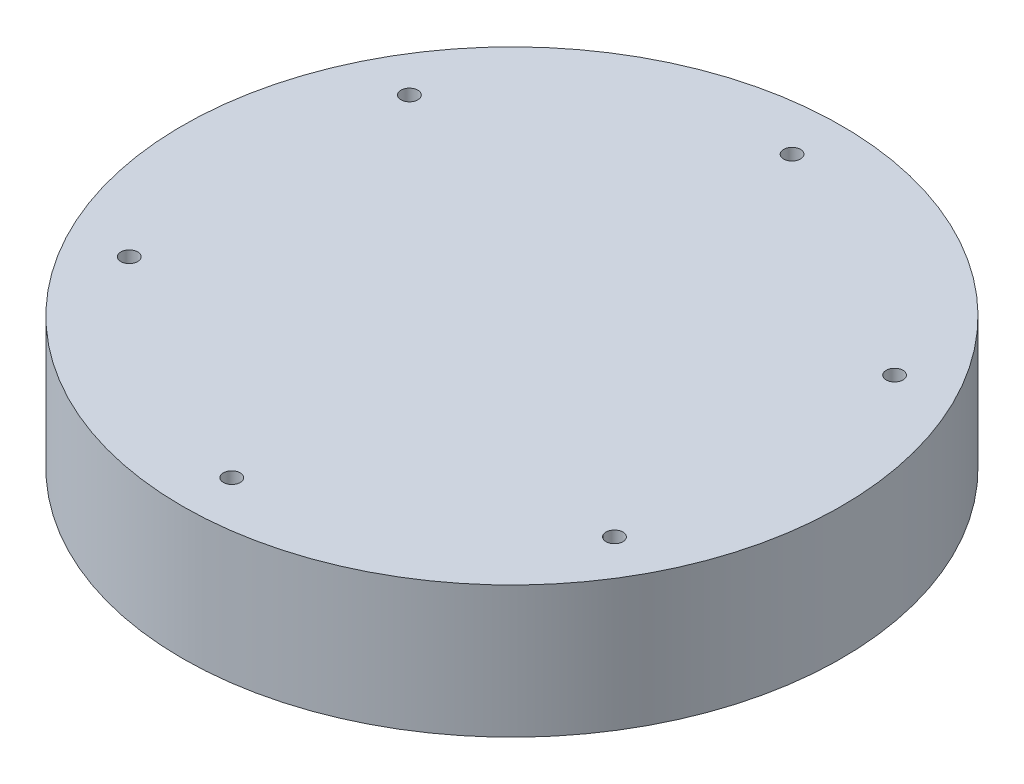
ISO-10303-21;
HEADER;
FILE_DESCRIPTION(('STEP AP214'),'2;1');
FILE_NAME('part.step','',(''),(''),'','','');
FILE_SCHEMA(('AUTOMOTIVE_DESIGN { 1 0 10303 214 1 1 1 1 }'));
ENDSEC;
DATA;
#1=APPLICATION_CONTEXT('core data for automotive mechanical design processes');
#2=APPLICATION_PROTOCOL_DEFINITION('international standard','automotive_design',2000,#1);
#3=PRODUCT_CONTEXT('',#1,'mechanical');
#4=PRODUCT('Part','Part','',(#3));
#5=PRODUCT_RELATED_PRODUCT_CATEGORY('part','',(#4));
#6=PRODUCT_DEFINITION_FORMATION('','',#4);
#7=PRODUCT_DEFINITION_CONTEXT('part definition',#1,'design');
#8=PRODUCT_DEFINITION('design','',#6,#7);
#9=PRODUCT_DEFINITION_SHAPE('','',#8);
#10=(LENGTH_UNIT() NAMED_UNIT(*) SI_UNIT(.MILLI.,.METRE.));
#11=(NAMED_UNIT(*) PLANE_ANGLE_UNIT() SI_UNIT($,.RADIAN.));
#12=(NAMED_UNIT(*) SI_UNIT($,.STERADIAN.) SOLID_ANGLE_UNIT());
#13=UNCERTAINTY_MEASURE_WITH_UNIT(LENGTH_MEASURE(1.E-05),#10,'distance_accuracy_value','');
#14=(GEOMETRIC_REPRESENTATION_CONTEXT(3) GLOBAL_UNCERTAINTY_ASSIGNED_CONTEXT((#13)) GLOBAL_UNIT_ASSIGNED_CONTEXT((#10,
#11,#12)) REPRESENTATION_CONTEXT('',''));
#15=CARTESIAN_POINT('',(0.,0.,0.));
#16=DIRECTION('',(0.,0.,1.));
#17=DIRECTION('',(1.,0.,0.));
#18=AXIS2_PLACEMENT_3D('',#15,#16,#17);
#19=CARTESIAN_POINT('',(0.,40.,0.));
#20=DIRECTION('',(0.,-1.,0.));
#21=DIRECTION('',(0.,0.,-1.));
#22=AXIS2_PLACEMENT_3D('',#19,#20,#21);
#23=CYLINDRICAL_SURFACE('',#22,100.);
#24=CARTESIAN_POINT('',(0.,40.,0.));
#25=DIRECTION('',(0.,1.,0.));
#26=DIRECTION('',(0.,0.,1.));
#27=AXIS2_PLACEMENT_3D('',#24,#25,#26);
#28=CIRCLE('',#27,100.);
#29=CARTESIAN_POINT('',(0.,40.,100.));
#30=VERTEX_POINT('',#29);
#31=EDGE_CURVE('E11',#30,#30,#28,.T.);
#32=ORIENTED_EDGE('',*,*,#31,.F.);
#33=EDGE_LOOP('',(#32));
#34=FACE_BOUND('',#33,.T.);
#35=CARTESIAN_POINT('',(0.,0.,0.));
#36=DIRECTION('',(0.,1.,0.));
#37=DIRECTION('',(0.,0.,1.));
#38=AXIS2_PLACEMENT_3D('',#35,#36,#37);
#39=CIRCLE('',#38,100.);
#40=CARTESIAN_POINT('',(0.,0.,100.));
#41=VERTEX_POINT('',#40);
#42=EDGE_CURVE('E41',#41,#41,#39,.T.);
#43=ORIENTED_EDGE('',*,*,#42,.T.);
#44=EDGE_LOOP('',(#43));
#45=FACE_BOUND('',#44,.T.);
#46=ADVANCED_FACE('F38',(#34,#45),#23,.T.);
#47=CARTESIAN_POINT('',(0.,40.,0.));
#48=DIRECTION('',(0.,1.,0.));
#49=DIRECTION('',(0.,0.,1.));
#50=AXIS2_PLACEMENT_3D('',#47,#48,#49);
#51=PLANE('',#50);
#52=CARTESIAN_POINT('',(-73.6121593216768,40.,-42.5000000000009));
#53=DIRECTION('',(0.,1.,0.));
#54=DIRECTION('',(0.866025403784433,0.,0.50000000000001));
#55=AXIS2_PLACEMENT_3D('',#52,#53,#54);
#56=CIRCLE('',#55,2.55269999999999);
#57=CARTESIAN_POINT('',(-71.4014562734363,40.,-41.2236500000008));
#58=VERTEX_POINT('',#57);
#59=EDGE_CURVE('E75',#58,#58,#56,.T.);
#60=ORIENTED_EDGE('',*,*,#59,.F.);
#61=EDGE_LOOP('',(#60));
#62=FACE_BOUND('',#61,.T.);
#63=CARTESIAN_POINT('',(-73.6121593216777,40.,42.4999999999993));
#64=DIRECTION('',(0.,1.,0.));
#65=DIRECTION('',(0.866025403784443,0.,-0.499999999999992));
#66=AXIS2_PLACEMENT_3D('',#63,#64,#65);
#67=CIRCLE('',#66,2.55269999999999);
#68=CARTESIAN_POINT('',(-71.4014562734371,40.,41.2236499999993));
#69=VERTEX_POINT('',#68);
#70=EDGE_CURVE('E74',#69,#69,#67,.T.);
#71=ORIENTED_EDGE('',*,*,#70,.F.);
#72=EDGE_LOOP('',(#71));
#73=FACE_BOUND('',#72,.T.);
#74=CARTESIAN_POINT('',(0.,40.,85.));
#75=DIRECTION('',(0.,1.,0.));
#76=DIRECTION('',(0.,0.,-1.));
#77=AXIS2_PLACEMENT_3D('',#74,#75,#76);
#78=CIRCLE('',#77,2.55269999999999);
#79=CARTESIAN_POINT('',(0.,40.,82.4473));
#80=VERTEX_POINT('',#79);
#81=EDGE_CURVE('E85',#80,#80,#78,.T.);
#82=ORIENTED_EDGE('',*,*,#81,.F.);
#83=EDGE_LOOP('',(#82));
#84=FACE_BOUND('',#83,.T.);
#85=CARTESIAN_POINT('',(73.6121593216771,40.,42.5000000000003));
#86=DIRECTION('',(0.,1.,0.));
#87=DIRECTION('',(-0.866025403784436,0.,-0.500000000000004));
#88=AXIS2_PLACEMENT_3D('',#85,#86,#87);
#89=CIRCLE('',#88,2.55269999999999);
#90=CARTESIAN_POINT('',(71.4014562734366,40.,41.2236500000003));
#91=VERTEX_POINT('',#90);
#92=EDGE_CURVE('E91',#91,#91,#89,.T.);
#93=ORIENTED_EDGE('',*,*,#92,.F.);
#94=EDGE_LOOP('',(#93));
#95=FACE_BOUND('',#94,.T.);
#96=CARTESIAN_POINT('',(73.6121593216774,40.,-42.4999999999998));
#97=DIRECTION('',(0.,1.,0.));
#98=DIRECTION('',(-0.86602540378444,0.,0.499999999999998));
#99=AXIS2_PLACEMENT_3D('',#96,#97,#98);
#100=CIRCLE('',#99,2.55269999999999);
#101=CARTESIAN_POINT('',(71.4014562734369,40.,-41.2236499999999));
#102=VERTEX_POINT('',#101);
#103=EDGE_CURVE('E97',#102,#102,#100,.T.);
#104=ORIENTED_EDGE('',*,*,#103,.F.);
#105=EDGE_LOOP('',(#104));
#106=FACE_BOUND('',#105,.T.);
#107=CARTESIAN_POINT('',(0.,40.,-85.));
#108=DIRECTION('',(0.,1.,0.));
#109=DIRECTION('',(0.,0.,1.));
#110=AXIS2_PLACEMENT_3D('',#107,#108,#109);
#111=CIRCLE('',#110,2.55269999999999);
#112=CARTESIAN_POINT('',(0.,40.,-82.4473));
#113=VERTEX_POINT('',#112);
#114=EDGE_CURVE('E103',#113,#113,#111,.T.);
#115=ORIENTED_EDGE('',*,*,#114,.F.);
#116=EDGE_LOOP('',(#115));
#117=FACE_BOUND('',#116,.T.);
#118=ORIENTED_EDGE('',*,*,#31,.T.);
#119=EDGE_LOOP('',(#118));
#120=FACE_BOUND('',#119,.T.);
#121=ADVANCED_FACE('F117',(#62,#73,#84,#95,#106,#117,#120),#51,.T.);
#122=CARTESIAN_POINT('',(0.,0.,0.));
#123=DIRECTION('',(0.,1.,0.));
#124=DIRECTION('',(0.,0.,1.));
#125=AXIS2_PLACEMENT_3D('',#122,#123,#124);
#126=PLANE('',#125);
#127=ORIENTED_EDGE('',*,*,#42,.F.);
#128=EDGE_LOOP('',(#127));
#129=FACE_BOUND('',#128,.T.);
#130=ADVANCED_FACE('F114',(#129),#126,.F.);
#131=CARTESIAN_POINT('',(0.,23.49,-85.));
#132=DIRECTION('',(0.,1.,0.));
#133=DIRECTION('',(0.,0.,1.));
#134=AXIS2_PLACEMENT_3D('',#131,#132,#133);
#135=CONICAL_SURFACE('',#134,2.55269999999999,1.02974425867665);
#136=CARTESIAN_POINT('',(0.,21.9561830978084,-85.));
#137=VERTEX_POINT('',#136);
#138=VERTEX_LOOP('',#137);
#139=FACE_BOUND('',#138,.T.);
#140=CARTESIAN_POINT('',(0.,23.49,-85.));
#141=DIRECTION('',(0.,1.,0.));
#142=DIRECTION('',(0.,0.,1.));
#143=AXIS2_PLACEMENT_3D('',#140,#141,#142);
#144=CIRCLE('',#143,2.55269999999999);
#145=CARTESIAN_POINT('',(0.,23.49,-82.4473));
#146=VERTEX_POINT('',#145);
#147=EDGE_CURVE('E106',#146,#146,#144,.T.);
#148=ORIENTED_EDGE('',*,*,#147,.T.);
#149=EDGE_LOOP('',(#148));
#150=FACE_BOUND('',#149,.T.);
#151=ADVANCED_FACE('F116',(#139,#150),#135,.F.);
#152=CARTESIAN_POINT('',(0.,40.,-85.));
#153=DIRECTION('',(0.,1.,0.));
#154=DIRECTION('',(0.,0.,1.));
#155=AXIS2_PLACEMENT_3D('',#152,#153,#154);
#156=CYLINDRICAL_SURFACE('',#155,2.55269999999999);
#157=ORIENTED_EDGE('',*,*,#147,.F.);
#158=EDGE_LOOP('',(#157));
#159=FACE_BOUND('',#158,.T.);
#160=ORIENTED_EDGE('',*,*,#114,.T.);
#161=EDGE_LOOP('',(#160));
#162=FACE_BOUND('',#161,.T.);
#163=ADVANCED_FACE('F122',(#159,#162),#156,.F.);
#164=CARTESIAN_POINT('',(73.6121593216774,23.49,-42.4999999999998));
#165=DIRECTION('',(0.,1.,0.));
#166=DIRECTION('',(-0.86602540378444,0.,0.499999999999998));
#167=AXIS2_PLACEMENT_3D('',#164,#165,#166);
#168=CONICAL_SURFACE('',#167,2.55269999999999,1.02974425867665);
#169=CARTESIAN_POINT('',(73.6121593216774,21.9561830978084,-42.4999999999998));
#170=VERTEX_POINT('',#169);
#171=VERTEX_LOOP('',#170);
#172=FACE_BOUND('',#171,.T.);
#173=CARTESIAN_POINT('',(73.6121593216774,23.49,-42.4999999999998));
#174=DIRECTION('',(0.,1.,0.));
#175=DIRECTION('',(-0.86602540378444,0.,0.499999999999998));
#176=AXIS2_PLACEMENT_3D('',#173,#174,#175);
#177=CIRCLE('',#176,2.55269999999999);
#178=CARTESIAN_POINT('',(71.4014562734369,23.49,-41.2236499999999));
#179=VERTEX_POINT('',#178);
#180=EDGE_CURVE('E100',#179,#179,#177,.T.);
#181=ORIENTED_EDGE('',*,*,#180,.T.);
#182=EDGE_LOOP('',(#181));
#183=FACE_BOUND('',#182,.T.);
#184=ADVANCED_FACE('F147',(#172,#183),#168,.F.);
#185=CARTESIAN_POINT('',(73.6121593216774,40.,-42.4999999999998));
#186=DIRECTION('',(0.,1.,0.));
#187=DIRECTION('',(-0.86602540378444,0.,0.499999999999998));
#188=AXIS2_PLACEMENT_3D('',#185,#186,#187);
#189=CYLINDRICAL_SURFACE('',#188,2.55269999999999);
#190=ORIENTED_EDGE('',*,*,#180,.F.);
#191=EDGE_LOOP('',(#190));
#192=FACE_BOUND('',#191,.T.);
#193=ORIENTED_EDGE('',*,*,#103,.T.);
#194=EDGE_LOOP('',(#193));
#195=FACE_BOUND('',#194,.T.);
#196=ADVANCED_FACE('F152',(#192,#195),#189,.F.);
#197=CARTESIAN_POINT('',(73.6121593216771,23.49,42.5000000000003));
#198=DIRECTION('',(0.,1.,0.));
#199=DIRECTION('',(-0.866025403784436,0.,-0.500000000000004));
#200=AXIS2_PLACEMENT_3D('',#197,#198,#199);
#201=CONICAL_SURFACE('',#200,2.55269999999999,1.02974425867665);
#202=CARTESIAN_POINT('',(73.6121593216771,21.9561830978084,42.5000000000003));
#203=VERTEX_POINT('',#202);
#204=VERTEX_LOOP('',#203);
#205=FACE_BOUND('',#204,.T.);
#206=CARTESIAN_POINT('',(73.6121593216771,23.49,42.5000000000003));
#207=DIRECTION('',(0.,1.,0.));
#208=DIRECTION('',(-0.866025403784436,0.,-0.500000000000004));
#209=AXIS2_PLACEMENT_3D('',#206,#207,#208);
#210=CIRCLE('',#209,2.55269999999999);
#211=CARTESIAN_POINT('',(71.4014562734366,23.49,41.2236500000003));
#212=VERTEX_POINT('',#211);
#213=EDGE_CURVE('E94',#212,#212,#210,.T.);
#214=ORIENTED_EDGE('',*,*,#213,.T.);
#215=EDGE_LOOP('',(#214));
#216=FACE_BOUND('',#215,.T.);
#217=ADVANCED_FACE('F163',(#205,#216),#201,.F.);
#218=CARTESIAN_POINT('',(73.6121593216771,40.,42.5000000000003));
#219=DIRECTION('',(0.,1.,0.));
#220=DIRECTION('',(-0.866025403784436,0.,-0.500000000000004));
#221=AXIS2_PLACEMENT_3D('',#218,#219,#220);
#222=CYLINDRICAL_SURFACE('',#221,2.55269999999999);
#223=ORIENTED_EDGE('',*,*,#213,.F.);
#224=EDGE_LOOP('',(#223));
#225=FACE_BOUND('',#224,.T.);
#226=ORIENTED_EDGE('',*,*,#92,.T.);
#227=EDGE_LOOP('',(#226));
#228=FACE_BOUND('',#227,.T.);
#229=ADVANCED_FACE('F176',(#225,#228),#222,.F.);
#230=CARTESIAN_POINT('',(0.,23.49,85.));
#231=DIRECTION('',(0.,1.,0.));
#232=DIRECTION('',(0.,0.,-1.));
#233=AXIS2_PLACEMENT_3D('',#230,#231,#232);
#234=CONICAL_SURFACE('',#233,2.55269999999999,1.02974425867665);
#235=CARTESIAN_POINT('',(0.,21.9561830978084,85.));
#236=VERTEX_POINT('',#235);
#237=VERTEX_LOOP('',#236);
#238=FACE_BOUND('',#237,.T.);
#239=CARTESIAN_POINT('',(0.,23.49,85.));
#240=DIRECTION('',(0.,1.,0.));
#241=DIRECTION('',(0.,0.,-1.));
#242=AXIS2_PLACEMENT_3D('',#239,#240,#241);
#243=CIRCLE('',#242,2.55269999999999);
#244=CARTESIAN_POINT('',(0.,23.49,82.4473));
#245=VERTEX_POINT('',#244);
#246=EDGE_CURVE('E88',#245,#245,#243,.T.);
#247=ORIENTED_EDGE('',*,*,#246,.T.);
#248=EDGE_LOOP('',(#247));
#249=FACE_BOUND('',#248,.T.);
#250=ADVANCED_FACE('F186',(#238,#249),#234,.F.);
#251=CARTESIAN_POINT('',(0.,40.,85.));
#252=DIRECTION('',(0.,1.,0.));
#253=DIRECTION('',(0.,0.,-1.));
#254=AXIS2_PLACEMENT_3D('',#251,#252,#253);
#255=CYLINDRICAL_SURFACE('',#254,2.55269999999999);
#256=ORIENTED_EDGE('',*,*,#246,.F.);
#257=EDGE_LOOP('',(#256));
#258=FACE_BOUND('',#257,.T.);
#259=ORIENTED_EDGE('',*,*,#81,.T.);
#260=EDGE_LOOP('',(#259));
#261=FACE_BOUND('',#260,.T.);
#262=ADVANCED_FACE('F198',(#258,#261),#255,.F.);
#263=CARTESIAN_POINT('',(-73.6121593216777,23.49,42.4999999999993));
#264=DIRECTION('',(0.,1.,0.));
#265=DIRECTION('',(0.866025403784443,0.,-0.499999999999992));
#266=AXIS2_PLACEMENT_3D('',#263,#264,#265);
#267=CONICAL_SURFACE('',#266,2.55269999999999,1.02974425867665);
#268=CARTESIAN_POINT('',(-73.6121593216777,21.9561830978084,42.4999999999993));
#269=VERTEX_POINT('',#268);
#270=VERTEX_LOOP('',#269);
#271=FACE_BOUND('',#270,.T.);
#272=CARTESIAN_POINT('',(-73.6121593216777,23.49,42.4999999999993));
#273=DIRECTION('',(0.,1.,0.));
#274=DIRECTION('',(0.866025403784443,0.,-0.499999999999992));
#275=AXIS2_PLACEMENT_3D('',#272,#273,#274);
#276=CIRCLE('',#275,2.55269999999999);
#277=CARTESIAN_POINT('',(-71.4014562734371,23.49,41.2236499999993));
#278=VERTEX_POINT('',#277);
#279=EDGE_CURVE('E78',#278,#278,#276,.T.);
#280=ORIENTED_EDGE('',*,*,#279,.T.);
#281=EDGE_LOOP('',(#280));
#282=FACE_BOUND('',#281,.T.);
#283=ADVANCED_FACE('F208',(#271,#282),#267,.F.);
#284=CARTESIAN_POINT('',(-73.6121593216777,40.,42.4999999999993));
#285=DIRECTION('',(0.,1.,0.));
#286=DIRECTION('',(0.866025403784443,0.,-0.499999999999992));
#287=AXIS2_PLACEMENT_3D('',#284,#285,#286);
#288=CYLINDRICAL_SURFACE('',#287,2.55269999999999);
#289=ORIENTED_EDGE('',*,*,#279,.F.);
#290=EDGE_LOOP('',(#289));
#291=FACE_BOUND('',#290,.T.);
#292=ORIENTED_EDGE('',*,*,#70,.T.);
#293=EDGE_LOOP('',(#292));
#294=FACE_BOUND('',#293,.T.);
#295=ADVANCED_FACE('F68',(#291,#294),#288,.F.);
#296=CARTESIAN_POINT('',(-73.6121593216768,23.49,-42.5000000000009));
#297=DIRECTION('',(0.,1.,0.));
#298=DIRECTION('',(0.866025403784433,0.,0.50000000000001));
#299=AXIS2_PLACEMENT_3D('',#296,#297,#298);
#300=CONICAL_SURFACE('',#299,2.55269999999999,1.02974425867665);
#301=CARTESIAN_POINT('',(-73.6121593216768,21.9561830978084,-42.5000000000009));
#302=VERTEX_POINT('',#301);
#303=VERTEX_LOOP('',#302);
#304=FACE_BOUND('',#303,.T.);
#305=CARTESIAN_POINT('',(-73.6121593216768,23.49,-42.5000000000009));
#306=DIRECTION('',(0.,1.,0.));
#307=DIRECTION('',(0.866025403784433,0.,0.50000000000001));
#308=AXIS2_PLACEMENT_3D('',#305,#306,#307);
#309=CIRCLE('',#308,2.55269999999999);
#310=CARTESIAN_POINT('',(-71.4014562734363,23.49,-41.2236500000008));
#311=VERTEX_POINT('',#310);
#312=EDGE_CURVE('E72',#311,#311,#309,.T.);
#313=ORIENTED_EDGE('',*,*,#312,.T.);
#314=EDGE_LOOP('',(#313));
#315=FACE_BOUND('',#314,.T.);
#316=ADVANCED_FACE('F64',(#304,#315),#300,.F.);
#317=CARTESIAN_POINT('',(-73.6121593216768,40.,-42.5000000000009));
#318=DIRECTION('',(0.,1.,0.));
#319=DIRECTION('',(0.866025403784433,0.,0.50000000000001));
#320=AXIS2_PLACEMENT_3D('',#317,#318,#319);
#321=CYLINDRICAL_SURFACE('',#320,2.55269999999999);
#322=ORIENTED_EDGE('',*,*,#312,.F.);
#323=EDGE_LOOP('',(#322));
#324=FACE_BOUND('',#323,.T.);
#325=ORIENTED_EDGE('',*,*,#59,.T.);
#326=EDGE_LOOP('',(#325));
#327=FACE_BOUND('',#326,.T.);
#328=ADVANCED_FACE('F67',(#324,#327),#321,.F.);
#329=CLOSED_SHELL('',(#46,#121,#130,#151,#163,#184,#196,#217,#229,#250,#262,#283,#295,#316,#328));
#330=MANIFOLD_SOLID_BREP('B2',#329);
#331=ADVANCED_BREP_SHAPE_REPRESENTATION('',(#18,#330),#14);
#332=SHAPE_DEFINITION_REPRESENTATION(#9,#331);
ENDSEC;
END-ISO-10303-21;
